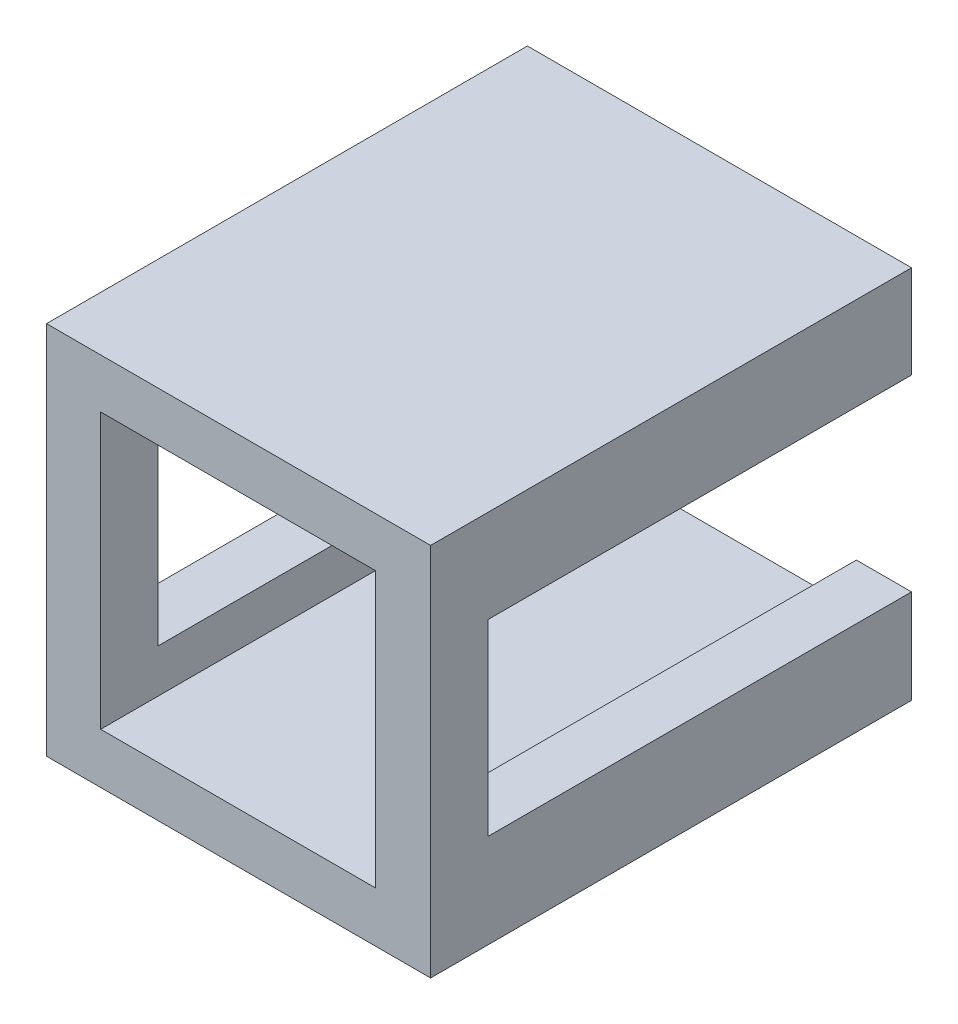
ISO-10303-21;
HEADER;
FILE_DESCRIPTION(('STEP AP214'),'2;1');
FILE_NAME('part.step','',(''),(''),'','','');
FILE_SCHEMA(('AUTOMOTIVE_DESIGN { 1 0 10303 214 1 1 1 1 }'));
ENDSEC;
DATA;
#1=APPLICATION_CONTEXT('core data for automotive mechanical design processes');
#2=APPLICATION_PROTOCOL_DEFINITION('international standard','automotive_design',2000,#1);
#3=PRODUCT_CONTEXT('',#1,'mechanical');
#4=PRODUCT('Part','Part','',(#3));
#5=PRODUCT_RELATED_PRODUCT_CATEGORY('part','',(#4));
#6=PRODUCT_DEFINITION_FORMATION('','',#4);
#7=PRODUCT_DEFINITION_CONTEXT('part definition',#1,'design');
#8=PRODUCT_DEFINITION('design','',#6,#7);
#9=PRODUCT_DEFINITION_SHAPE('','',#8);
#10=(LENGTH_UNIT() NAMED_UNIT(*) SI_UNIT(.MILLI.,.METRE.));
#11=(NAMED_UNIT(*) PLANE_ANGLE_UNIT() SI_UNIT($,.RADIAN.));
#12=(NAMED_UNIT(*) SI_UNIT($,.STERADIAN.) SOLID_ANGLE_UNIT());
#13=UNCERTAINTY_MEASURE_WITH_UNIT(LENGTH_MEASURE(1.E-05),#10,'distance_accuracy_value','');
#14=(GEOMETRIC_REPRESENTATION_CONTEXT(3) GLOBAL_UNCERTAINTY_ASSIGNED_CONTEXT((#13)) GLOBAL_UNIT_ASSIGNED_CONTEXT((#10,
#11,#12)) REPRESENTATION_CONTEXT('',''));
#15=CARTESIAN_POINT('',(0.,0.,0.));
#16=DIRECTION('',(0.,0.,1.));
#17=DIRECTION('',(1.,0.,0.));
#18=AXIS2_PLACEMENT_3D('',#15,#16,#17);
#19=CARTESIAN_POINT('',(0.,0.,0.));
#20=DIRECTION('',(0.,0.,1.));
#21=DIRECTION('',(1.,0.,0.));
#22=AXIS2_PLACEMENT_3D('',#19,#20,#21);
#23=PLANE('',#22);
#24=DIRECTION('',(0.,-1.,0.));
#25=VECTOR('',#24,1.);
#26=CARTESIAN_POINT('',(-836.642503940977,-820.264035435303,0.));
#27=LINE('',#26,#25);
#28=CARTESIAN_POINT('',(-836.642503940977,-410.,0.));
#29=VERTEX_POINT('',#28);
#30=CARTESIAN_POINT('',(-836.642503940977,-820.264035435303,0.));
#31=VERTEX_POINT('',#30);
#32=EDGE_CURVE('E184',#29,#31,#27,.T.);
#33=ORIENTED_EDGE('',*,*,#32,.F.);
#34=DIRECTION('',(1.,0.,0.));
#35=VECTOR('',#34,1.);
#36=CARTESIAN_POINT('',(-1159.24759537273,-410.,0.));
#37=LINE('',#36,#35);
#38=CARTESIAN_POINT('',(-600.,-410.,0.));
#39=VERTEX_POINT('',#38);
#40=EDGE_CURVE('E277',#29,#39,#37,.T.);
#41=ORIENTED_EDGE('',*,*,#40,.T.);
#42=DIRECTION('',(0.,-1.,0.));
#43=VECTOR('',#42,1.);
#44=CARTESIAN_POINT('',(-600.,-600.,0.));
#45=LINE('',#44,#43);
#46=CARTESIAN_POINT('',(-600.,-600.,0.));
#47=VERTEX_POINT('',#46);
#48=EDGE_CURVE('E225',#39,#47,#45,.T.);
#49=ORIENTED_EDGE('',*,*,#48,.T.);
#50=DIRECTION('',(1.,0.,0.));
#51=VECTOR('',#50,1.);
#52=CARTESIAN_POINT('',(-600.,-600.,0.));
#53=LINE('',#52,#51);
#54=CARTESIAN_POINT('',(600.,-600.,0.));
#55=VERTEX_POINT('',#54);
#56=EDGE_CURVE('E286',#47,#55,#53,.T.);
#57=ORIENTED_EDGE('',*,*,#56,.T.);
#58=DIRECTION('',(0.,1.,0.));
#59=VECTOR('',#58,1.);
#60=CARTESIAN_POINT('',(600.,-600.,0.));
#61=LINE('',#60,#59);
#62=CARTESIAN_POINT('',(600.,-410.,0.));
#63=VERTEX_POINT('',#62);
#64=EDGE_CURVE('E237',#55,#63,#61,.T.);
#65=ORIENTED_EDGE('',*,*,#64,.T.);
#66=CARTESIAN_POINT('',(840.752404627269,-410.,0.));
#67=VERTEX_POINT('',#66);
#68=EDGE_CURVE('E219',#63,#67,#37,.T.);
#69=ORIENTED_EDGE('',*,*,#68,.T.);
#70=DIRECTION('',(0.,1.,0.));
#71=VECTOR('',#70,1.);
#72=CARTESIAN_POINT('',(840.752404627269,-820.264035435303,0.));
#73=LINE('',#72,#71);
#74=CARTESIAN_POINT('',(840.752404627269,-820.264035435303,0.));
#75=VERTEX_POINT('',#74);
#76=EDGE_CURVE('E175',#75,#67,#73,.T.);
#77=ORIENTED_EDGE('',*,*,#76,.F.);
#78=DIRECTION('',(1.,0.,0.));
#79=VECTOR('',#78,1.);
#80=CARTESIAN_POINT('',(-836.642503940977,-820.264035435303,0.));
#81=LINE('',#80,#79);
#82=EDGE_CURVE('E176',#31,#75,#81,.T.);
#83=ORIENTED_EDGE('',*,*,#82,.F.);
#84=EDGE_LOOP('',(#33,#41,#49,#57,#65,#69,#77,#83));
#85=FACE_BOUND('',#84,.T.);
#86=ADVANCED_FACE('F39',(#85),#23,.F.);
#87=CARTESIAN_POINT('',(0.,0.,2100.));
#88=DIRECTION('',(0.,0.,1.));
#89=DIRECTION('',(1.,0.,0.));
#90=AXIS2_PLACEMENT_3D('',#87,#88,#89);
#91=PLANE('',#90);
#92=DIRECTION('',(1.,0.,0.));
#93=VECTOR('',#92,1.);
#94=CARTESIAN_POINT('',(-836.642503940977,-820.264035435303,2100.));
#95=LINE('',#94,#93);
#96=CARTESIAN_POINT('',(-836.642503940977,-820.264035435303,2100.));
#97=VERTEX_POINT('',#96);
#98=CARTESIAN_POINT('',(840.752404627269,-820.264035435303,2100.));
#99=VERTEX_POINT('',#98);
#100=EDGE_CURVE('E188',#97,#99,#95,.T.);
#101=ORIENTED_EDGE('',*,*,#100,.T.);
#102=DIRECTION('',(0.,1.,0.));
#103=VECTOR('',#102,1.);
#104=CARTESIAN_POINT('',(840.752404627269,-820.264035435303,2100.));
#105=LINE('',#104,#103);
#106=CARTESIAN_POINT('',(840.752404627269,815.765390566207,2100.));
#107=VERTEX_POINT('',#106);
#108=EDGE_CURVE('E252',#99,#107,#105,.T.);
#109=ORIENTED_EDGE('',*,*,#108,.T.);
#110=DIRECTION('',(-1.,0.,0.));
#111=VECTOR('',#110,1.);
#112=CARTESIAN_POINT('',(-836.642503940977,815.765390566207,2100.));
#113=LINE('',#112,#111);
#114=CARTESIAN_POINT('',(-836.642503940977,815.765390566207,2100.));
#115=VERTEX_POINT('',#114);
#116=EDGE_CURVE('E254',#107,#115,#113,.T.);
#117=ORIENTED_EDGE('',*,*,#116,.T.);
#118=DIRECTION('',(0.,-1.,0.));
#119=VECTOR('',#118,1.);
#120=CARTESIAN_POINT('',(-836.642503940977,-820.264035435303,2100.));
#121=LINE('',#120,#119);
#122=EDGE_CURVE('E193',#115,#97,#121,.T.);
#123=ORIENTED_EDGE('',*,*,#122,.T.);
#124=EDGE_LOOP('',(#101,#109,#117,#123));
#125=FACE_BOUND('',#124,.T.);
#126=DIRECTION('',(0.,1.,0.));
#127=VECTOR('',#126,1.);
#128=CARTESIAN_POINT('',(600.,-600.,2100.));
#129=LINE('',#128,#127);
#130=CARTESIAN_POINT('',(600.,-600.,2100.));
#131=VERTEX_POINT('',#130);
#132=CARTESIAN_POINT('',(600.,600.,2100.));
#133=VERTEX_POINT('',#132);
#134=EDGE_CURVE('E288',#131,#133,#129,.T.);
#135=ORIENTED_EDGE('',*,*,#134,.F.);
#136=DIRECTION('',(1.,0.,0.));
#137=VECTOR('',#136,1.);
#138=CARTESIAN_POINT('',(-600.,-600.,2100.));
#139=LINE('',#138,#137);
#140=CARTESIAN_POINT('',(-600.,-600.,2100.));
#141=VERTEX_POINT('',#140);
#142=EDGE_CURVE('E235',#141,#131,#139,.T.);
#143=ORIENTED_EDGE('',*,*,#142,.F.);
#144=DIRECTION('',(0.,-1.,0.));
#145=VECTOR('',#144,1.);
#146=CARTESIAN_POINT('',(-600.,-600.,2100.));
#147=LINE('',#146,#145);
#148=CARTESIAN_POINT('',(-600.,600.,2100.));
#149=VERTEX_POINT('',#148);
#150=EDGE_CURVE('E243',#149,#141,#147,.T.);
#151=ORIENTED_EDGE('',*,*,#150,.F.);
#152=DIRECTION('',(-1.,0.,0.));
#153=VECTOR('',#152,1.);
#154=CARTESIAN_POINT('',(-600.,600.,2100.));
#155=LINE('',#154,#153);
#156=EDGE_CURVE('E290',#133,#149,#155,.T.);
#157=ORIENTED_EDGE('',*,*,#156,.F.);
#158=EDGE_LOOP('',(#135,#143,#151,#157));
#159=FACE_BOUND('',#158,.T.);
#160=ADVANCED_FACE('F258',(#125,#159),#91,.T.);
#161=CARTESIAN_POINT('',(840.752404627269,410.,0.));
#162=VERTEX_POINT('',#161);
#163=CARTESIAN_POINT('',(840.752404627269,815.765390566207,0.));
#164=VERTEX_POINT('',#163);
#165=EDGE_CURVE('E165',#162,#164,#73,.T.);
#166=ORIENTED_EDGE('',*,*,#165,.F.);
#167=DIRECTION('',(1.,0.,0.));
#168=VECTOR('',#167,1.);
#169=CARTESIAN_POINT('',(-1159.24759537273,410.,0.));
#170=LINE('',#169,#168);
#171=CARTESIAN_POINT('',(600.,410.,0.));
#172=VERTEX_POINT('',#171);
#173=EDGE_CURVE('E149',#172,#162,#170,.T.);
#174=ORIENTED_EDGE('',*,*,#173,.F.);
#175=CARTESIAN_POINT('',(600.,600.,0.));
#176=VERTEX_POINT('',#175);
#177=EDGE_CURVE('E294',#172,#176,#61,.T.);
#178=ORIENTED_EDGE('',*,*,#177,.T.);
#179=DIRECTION('',(-1.,0.,0.));
#180=VECTOR('',#179,1.);
#181=CARTESIAN_POINT('',(-600.,600.,0.));
#182=LINE('',#181,#180);
#183=CARTESIAN_POINT('',(-600.,600.,0.));
#184=VERTEX_POINT('',#183);
#185=EDGE_CURVE('E232',#176,#184,#182,.T.);
#186=ORIENTED_EDGE('',*,*,#185,.T.);
#187=CARTESIAN_POINT('',(-600.,410.,0.));
#188=VERTEX_POINT('',#187);
#189=EDGE_CURVE('E231',#184,#188,#45,.T.);
#190=ORIENTED_EDGE('',*,*,#189,.T.);
#191=CARTESIAN_POINT('',(-836.642503940977,410.,0.));
#192=VERTEX_POINT('',#191);
#193=EDGE_CURVE('E62',#192,#188,#170,.T.);
#194=ORIENTED_EDGE('',*,*,#193,.F.);
#195=CARTESIAN_POINT('',(-836.642503940977,815.765390566207,0.));
#196=VERTEX_POINT('',#195);
#197=EDGE_CURVE('E185',#196,#192,#27,.T.);
#198=ORIENTED_EDGE('',*,*,#197,.F.);
#199=DIRECTION('',(-1.,0.,0.));
#200=VECTOR('',#199,1.);
#201=CARTESIAN_POINT('',(-836.642503940977,815.765390566207,0.));
#202=LINE('',#201,#200);
#203=EDGE_CURVE('E174',#164,#196,#202,.T.);
#204=ORIENTED_EDGE('',*,*,#203,.F.);
#205=EDGE_LOOP('',(#166,#174,#178,#186,#190,#194,#198,#204));
#206=FACE_BOUND('',#205,.T.);
#207=ADVANCED_FACE('F172',(#206),#23,.F.);
#208=CARTESIAN_POINT('',(-836.642503940977,-820.264035435303,2100.));
#209=DIRECTION('',(0.,1.,0.));
#210=DIRECTION('',(-1.,0.,0.));
#211=AXIS2_PLACEMENT_3D('',#208,#209,#210);
#212=PLANE('',#211);
#213=ORIENTED_EDGE('',*,*,#82,.T.);
#214=DIRECTION('',(0.,0.,-1.));
#215=VECTOR('',#214,1.);
#216=CARTESIAN_POINT('',(840.752404627269,-820.264035435303,2100.));
#217=LINE('',#216,#215);
#218=EDGE_CURVE('E198',#99,#75,#217,.T.);
#219=ORIENTED_EDGE('',*,*,#218,.F.);
#220=ORIENTED_EDGE('',*,*,#100,.F.);
#221=DIRECTION('',(0.,0.,-1.));
#222=VECTOR('',#221,1.);
#223=CARTESIAN_POINT('',(-836.642503940977,-820.264035435303,2100.));
#224=LINE('',#223,#222);
#225=EDGE_CURVE('E189',#97,#31,#224,.T.);
#226=ORIENTED_EDGE('',*,*,#225,.T.);
#227=EDGE_LOOP('',(#213,#219,#220,#226));
#228=FACE_BOUND('',#227,.T.);
#229=ADVANCED_FACE('F41',(#228),#212,.F.);
#230=CARTESIAN_POINT('',(840.752404627269,-820.264035435303,2100.));
#231=DIRECTION('',(-1.,0.,0.));
#232=DIRECTION('',(0.,0.,1.));
#233=AXIS2_PLACEMENT_3D('',#230,#231,#232);
#234=PLANE('',#233);
#235=ORIENTED_EDGE('',*,*,#76,.T.);
#236=DIRECTION('',(0.,0.,-1.));
#237=VECTOR('',#236,1.);
#238=CARTESIAN_POINT('',(840.752404627269,-410.,0.));
#239=LINE('',#238,#237);
#240=CARTESIAN_POINT('',(840.752404627269,-410.,1850.));
#241=VERTEX_POINT('',#240);
#242=EDGE_CURVE('E159',#241,#67,#239,.T.);
#243=ORIENTED_EDGE('',*,*,#242,.F.);
#244=DIRECTION('',(0.,-1.,0.));
#245=VECTOR('',#244,1.);
#246=CARTESIAN_POINT('',(840.752404627269,-410.,1850.));
#247=LINE('',#246,#245);
#248=CARTESIAN_POINT('',(840.752404627269,410.,1850.));
#249=VERTEX_POINT('',#248);
#250=EDGE_CURVE('E169',#249,#241,#247,.T.);
#251=ORIENTED_EDGE('',*,*,#250,.F.);
#252=DIRECTION('',(0.,0.,1.));
#253=VECTOR('',#252,1.);
#254=CARTESIAN_POINT('',(840.752404627269,410.,0.));
#255=LINE('',#254,#253);
#256=EDGE_CURVE('E152',#162,#249,#255,.T.);
#257=ORIENTED_EDGE('',*,*,#256,.F.);
#258=ORIENTED_EDGE('',*,*,#165,.T.);
#259=DIRECTION('',(0.,0.,-1.));
#260=VECTOR('',#259,1.);
#261=CARTESIAN_POINT('',(840.752404627269,815.765390566207,2100.));
#262=LINE('',#261,#260);
#263=EDGE_CURVE('E196',#107,#164,#262,.T.);
#264=ORIENTED_EDGE('',*,*,#263,.F.);
#265=ORIENTED_EDGE('',*,*,#108,.F.);
#266=ORIENTED_EDGE('',*,*,#218,.T.);
#267=EDGE_LOOP('',(#235,#243,#251,#257,#258,#264,#265,#266));
#268=FACE_BOUND('',#267,.T.);
#269=ADVANCED_FACE('F163',(#268),#234,.F.);
#270=CARTESIAN_POINT('',(-836.642503940977,815.765390566207,2100.));
#271=DIRECTION('',(0.,-1.,0.));
#272=DIRECTION('',(1.,0.,0.));
#273=AXIS2_PLACEMENT_3D('',#270,#271,#272);
#274=PLANE('',#273);
#275=ORIENTED_EDGE('',*,*,#203,.T.);
#276=DIRECTION('',(0.,0.,-1.));
#277=VECTOR('',#276,1.);
#278=CARTESIAN_POINT('',(-836.642503940977,815.765390566207,2100.));
#279=LINE('',#278,#277);
#280=EDGE_CURVE('E192',#115,#196,#279,.T.);
#281=ORIENTED_EDGE('',*,*,#280,.F.);
#282=ORIENTED_EDGE('',*,*,#116,.F.);
#283=ORIENTED_EDGE('',*,*,#263,.T.);
#284=EDGE_LOOP('',(#275,#281,#282,#283));
#285=FACE_BOUND('',#284,.T.);
#286=ADVANCED_FACE('F270',(#285),#274,.F.);
#287=CARTESIAN_POINT('',(-836.642503940977,-820.264035435303,2100.));
#288=DIRECTION('',(1.,0.,0.));
#289=DIRECTION('',(0.,0.,-1.));
#290=AXIS2_PLACEMENT_3D('',#287,#288,#289);
#291=PLANE('',#290);
#292=DIRECTION('',(0.,-1.,0.));
#293=VECTOR('',#292,1.);
#294=CARTESIAN_POINT('',(-836.642503940977,-820.264035435303,1850.));
#295=LINE('',#294,#293);
#296=CARTESIAN_POINT('',(-836.642503940977,410.,1850.));
#297=VERTEX_POINT('',#296);
#298=CARTESIAN_POINT('',(-836.642503940977,-410.,1850.));
#299=VERTEX_POINT('',#298);
#300=EDGE_CURVE('E281',#297,#299,#295,.T.);
#301=ORIENTED_EDGE('',*,*,#300,.T.);
#302=DIRECTION('',(0.,0.,-1.));
#303=VECTOR('',#302,1.);
#304=CARTESIAN_POINT('',(-836.642503940977,-410.,2100.));
#305=LINE('',#304,#303);
#306=EDGE_CURVE('E218',#299,#29,#305,.T.);
#307=ORIENTED_EDGE('',*,*,#306,.T.);
#308=ORIENTED_EDGE('',*,*,#32,.T.);
#309=ORIENTED_EDGE('',*,*,#225,.F.);
#310=ORIENTED_EDGE('',*,*,#122,.F.);
#311=ORIENTED_EDGE('',*,*,#280,.T.);
#312=ORIENTED_EDGE('',*,*,#197,.T.);
#313=DIRECTION('',(0.,0.,1.));
#314=VECTOR('',#313,1.);
#315=CARTESIAN_POINT('',(-836.642503940977,410.,2100.));
#316=LINE('',#315,#314);
#317=EDGE_CURVE('E276',#192,#297,#316,.T.);
#318=ORIENTED_EDGE('',*,*,#317,.T.);
#319=EDGE_LOOP('',(#301,#307,#308,#309,#310,#311,#312,#318));
#320=FACE_BOUND('',#319,.T.);
#321=ADVANCED_FACE('F265',(#320),#291,.F.);
#322=CARTESIAN_POINT('',(-600.,-600.,2100.));
#323=DIRECTION('',(0.,1.,0.));
#324=DIRECTION('',(-1.,0.,0.));
#325=AXIS2_PLACEMENT_3D('',#322,#323,#324);
#326=PLANE('',#325);
#327=ORIENTED_EDGE('',*,*,#56,.F.);
#328=DIRECTION('',(0.,0.,-1.));
#329=VECTOR('',#328,1.);
#330=CARTESIAN_POINT('',(-600.,-600.,2100.));
#331=LINE('',#330,#329);
#332=EDGE_CURVE('E227',#141,#47,#331,.T.);
#333=ORIENTED_EDGE('',*,*,#332,.F.);
#334=ORIENTED_EDGE('',*,*,#142,.T.);
#335=DIRECTION('',(0.,0.,-1.));
#336=VECTOR('',#335,1.);
#337=CARTESIAN_POINT('',(600.,-600.,2100.));
#338=LINE('',#337,#336);
#339=EDGE_CURVE('E179',#131,#55,#338,.T.);
#340=ORIENTED_EDGE('',*,*,#339,.T.);
#341=EDGE_LOOP('',(#327,#333,#334,#340));
#342=FACE_BOUND('',#341,.T.);
#343=ADVANCED_FACE('F319',(#342),#326,.T.);
#344=CARTESIAN_POINT('',(600.,-600.,2100.));
#345=DIRECTION('',(-1.,0.,0.));
#346=DIRECTION('',(0.,0.,1.));
#347=AXIS2_PLACEMENT_3D('',#344,#345,#346);
#348=PLANE('',#347);
#349=DIRECTION('',(0.,0.,1.));
#350=VECTOR('',#349,1.);
#351=CARTESIAN_POINT('',(600.,-410.,2100.));
#352=LINE('',#351,#350);
#353=CARTESIAN_POINT('',(600.,-410.,1850.));
#354=VERTEX_POINT('',#353);
#355=EDGE_CURVE('E283',#63,#354,#352,.T.);
#356=ORIENTED_EDGE('',*,*,#355,.F.);
#357=ORIENTED_EDGE('',*,*,#64,.F.);
#358=ORIENTED_EDGE('',*,*,#339,.F.);
#359=ORIENTED_EDGE('',*,*,#134,.T.);
#360=DIRECTION('',(0.,0.,-1.));
#361=VECTOR('',#360,1.);
#362=CARTESIAN_POINT('',(600.,600.,2100.));
#363=LINE('',#362,#361);
#364=EDGE_CURVE('E245',#133,#176,#363,.T.);
#365=ORIENTED_EDGE('',*,*,#364,.T.);
#366=ORIENTED_EDGE('',*,*,#177,.F.);
#367=DIRECTION('',(0.,0.,-1.));
#368=VECTOR('',#367,1.);
#369=CARTESIAN_POINT('',(600.,410.,2100.));
#370=LINE('',#369,#368);
#371=CARTESIAN_POINT('',(600.,410.,1850.));
#372=VERTEX_POINT('',#371);
#373=EDGE_CURVE('E155',#372,#172,#370,.T.);
#374=ORIENTED_EDGE('',*,*,#373,.F.);
#375=DIRECTION('',(0.,1.,0.));
#376=VECTOR('',#375,1.);
#377=CARTESIAN_POINT('',(600.,-600.,1850.));
#378=LINE('',#377,#376);
#379=EDGE_CURVE('E279',#354,#372,#378,.T.);
#380=ORIENTED_EDGE('',*,*,#379,.F.);
#381=EDGE_LOOP('',(#356,#357,#358,#359,#365,#366,#374,#380));
#382=FACE_BOUND('',#381,.T.);
#383=ADVANCED_FACE('F301',(#382),#348,.T.);
#384=CARTESIAN_POINT('',(-600.,600.,2100.));
#385=DIRECTION('',(0.,-1.,0.));
#386=DIRECTION('',(1.,0.,0.));
#387=AXIS2_PLACEMENT_3D('',#384,#385,#386);
#388=PLANE('',#387);
#389=ORIENTED_EDGE('',*,*,#185,.F.);
#390=ORIENTED_EDGE('',*,*,#364,.F.);
#391=ORIENTED_EDGE('',*,*,#156,.T.);
#392=DIRECTION('',(0.,0.,-1.));
#393=VECTOR('',#392,1.);
#394=CARTESIAN_POINT('',(-600.,600.,2100.));
#395=LINE('',#394,#393);
#396=EDGE_CURVE('E242',#149,#184,#395,.T.);
#397=ORIENTED_EDGE('',*,*,#396,.T.);
#398=EDGE_LOOP('',(#389,#390,#391,#397));
#399=FACE_BOUND('',#398,.T.);
#400=ADVANCED_FACE('F306',(#399),#388,.T.);
#401=CARTESIAN_POINT('',(-600.,-600.,2100.));
#402=DIRECTION('',(1.,0.,0.));
#403=DIRECTION('',(0.,0.,-1.));
#404=AXIS2_PLACEMENT_3D('',#401,#402,#403);
#405=PLANE('',#404);
#406=DIRECTION('',(0.,0.,-1.));
#407=VECTOR('',#406,1.);
#408=CARTESIAN_POINT('',(-600.,-410.,2100.));
#409=LINE('',#408,#407);
#410=CARTESIAN_POINT('',(-600.,-410.,1850.));
#411=VERTEX_POINT('',#410);
#412=EDGE_CURVE('E11',#411,#39,#409,.T.);
#413=ORIENTED_EDGE('',*,*,#412,.F.);
#414=DIRECTION('',(0.,-1.,0.));
#415=VECTOR('',#414,1.);
#416=CARTESIAN_POINT('',(-600.,-600.,1850.));
#417=LINE('',#416,#415);
#418=CARTESIAN_POINT('',(-600.,410.,1850.));
#419=VERTEX_POINT('',#418);
#420=EDGE_CURVE('E47',#419,#411,#417,.T.);
#421=ORIENTED_EDGE('',*,*,#420,.F.);
#422=DIRECTION('',(0.,0.,1.));
#423=VECTOR('',#422,1.);
#424=CARTESIAN_POINT('',(-600.,410.,2100.));
#425=LINE('',#424,#423);
#426=EDGE_CURVE('E201',#188,#419,#425,.T.);
#427=ORIENTED_EDGE('',*,*,#426,.F.);
#428=ORIENTED_EDGE('',*,*,#189,.F.);
#429=ORIENTED_EDGE('',*,*,#396,.F.);
#430=ORIENTED_EDGE('',*,*,#150,.T.);
#431=ORIENTED_EDGE('',*,*,#332,.T.);
#432=ORIENTED_EDGE('',*,*,#48,.F.);
#433=EDGE_LOOP('',(#413,#421,#427,#428,#429,#430,#431,#432));
#434=FACE_BOUND('',#433,.T.);
#435=ADVANCED_FACE('F223',(#434),#405,.T.);
#436=CARTESIAN_POINT('',(-1159.24759537273,410.,0.));
#437=DIRECTION('',(0.,1.,0.));
#438=DIRECTION('',(0.,0.,1.));
#439=AXIS2_PLACEMENT_3D('',#436,#437,#438);
#440=PLANE('',#439);
#441=ORIENTED_EDGE('',*,*,#193,.T.);
#442=ORIENTED_EDGE('',*,*,#426,.T.);
#443=DIRECTION('',(1.,0.,0.));
#444=VECTOR('',#443,1.);
#445=CARTESIAN_POINT('',(-1159.24759537273,410.,1850.));
#446=LINE('',#445,#444);
#447=EDGE_CURVE('E211',#297,#419,#446,.T.);
#448=ORIENTED_EDGE('',*,*,#447,.F.);
#449=ORIENTED_EDGE('',*,*,#317,.F.);
#450=EDGE_LOOP('',(#441,#442,#448,#449));
#451=FACE_BOUND('',#450,.T.);
#452=ADVANCED_FACE('F308',(#451),#440,.F.);
#453=CARTESIAN_POINT('',(-1159.24759537273,-410.,1850.));
#454=DIRECTION('',(0.,0.,1.));
#455=DIRECTION('',(1.,0.,0.));
#456=AXIS2_PLACEMENT_3D('',#453,#454,#455);
#457=PLANE('',#456);
#458=ORIENTED_EDGE('',*,*,#447,.T.);
#459=ORIENTED_EDGE('',*,*,#420,.T.);
#460=DIRECTION('',(1.,0.,0.));
#461=VECTOR('',#460,1.);
#462=CARTESIAN_POINT('',(-1159.24759537273,-410.,1850.));
#463=LINE('',#462,#461);
#464=EDGE_CURVE('E208',#299,#411,#463,.T.);
#465=ORIENTED_EDGE('',*,*,#464,.F.);
#466=ORIENTED_EDGE('',*,*,#300,.F.);
#467=EDGE_LOOP('',(#458,#459,#465,#466));
#468=FACE_BOUND('',#467,.T.);
#469=ADVANCED_FACE('F207',(#468),#457,.F.);
#470=CARTESIAN_POINT('',(-1159.24759537273,-410.,0.));
#471=DIRECTION('',(0.,-1.,0.));
#472=DIRECTION('',(0.,0.,-1.));
#473=AXIS2_PLACEMENT_3D('',#470,#471,#472);
#474=PLANE('',#473);
#475=ORIENTED_EDGE('',*,*,#464,.T.);
#476=ORIENTED_EDGE('',*,*,#412,.T.);
#477=ORIENTED_EDGE('',*,*,#40,.F.);
#478=ORIENTED_EDGE('',*,*,#306,.F.);
#479=EDGE_LOOP('',(#475,#476,#477,#478));
#480=FACE_BOUND('',#479,.T.);
#481=ADVANCED_FACE('F215',(#480),#474,.F.);
#482=ORIENTED_EDGE('',*,*,#355,.T.);
#483=EDGE_CURVE('E220',#354,#241,#463,.T.);
#484=ORIENTED_EDGE('',*,*,#483,.T.);
#485=ORIENTED_EDGE('',*,*,#242,.T.);
#486=ORIENTED_EDGE('',*,*,#68,.F.);
#487=EDGE_LOOP('',(#482,#484,#485,#486));
#488=FACE_BOUND('',#487,.T.);
#489=ADVANCED_FACE('F314',(#488),#474,.F.);
#490=ORIENTED_EDGE('',*,*,#379,.T.);
#491=EDGE_CURVE('E54',#372,#249,#446,.T.);
#492=ORIENTED_EDGE('',*,*,#491,.T.);
#493=ORIENTED_EDGE('',*,*,#250,.T.);
#494=ORIENTED_EDGE('',*,*,#483,.F.);
#495=EDGE_LOOP('',(#490,#492,#493,#494));
#496=FACE_BOUND('',#495,.T.);
#497=ADVANCED_FACE('F317',(#496),#457,.F.);
#498=ORIENTED_EDGE('',*,*,#373,.T.);
#499=ORIENTED_EDGE('',*,*,#173,.T.);
#500=ORIENTED_EDGE('',*,*,#256,.T.);
#501=ORIENTED_EDGE('',*,*,#491,.F.);
#502=EDGE_LOOP('',(#498,#499,#500,#501));
#503=FACE_BOUND('',#502,.T.);
#504=ADVANCED_FACE('F151',(#503),#440,.F.);
#505=CLOSED_SHELL('',(#86,#160,#207,#229,#269,#286,#321,#343,#383,#400,#435,#452,#469,#481,#489,
#497,#504));
#506=MANIFOLD_SOLID_BREP('B2',#505);
#507=ADVANCED_BREP_SHAPE_REPRESENTATION('',(#18,#506),#14);
#508=SHAPE_DEFINITION_REPRESENTATION(#9,#507);
ENDSEC;
END-ISO-10303-21;
